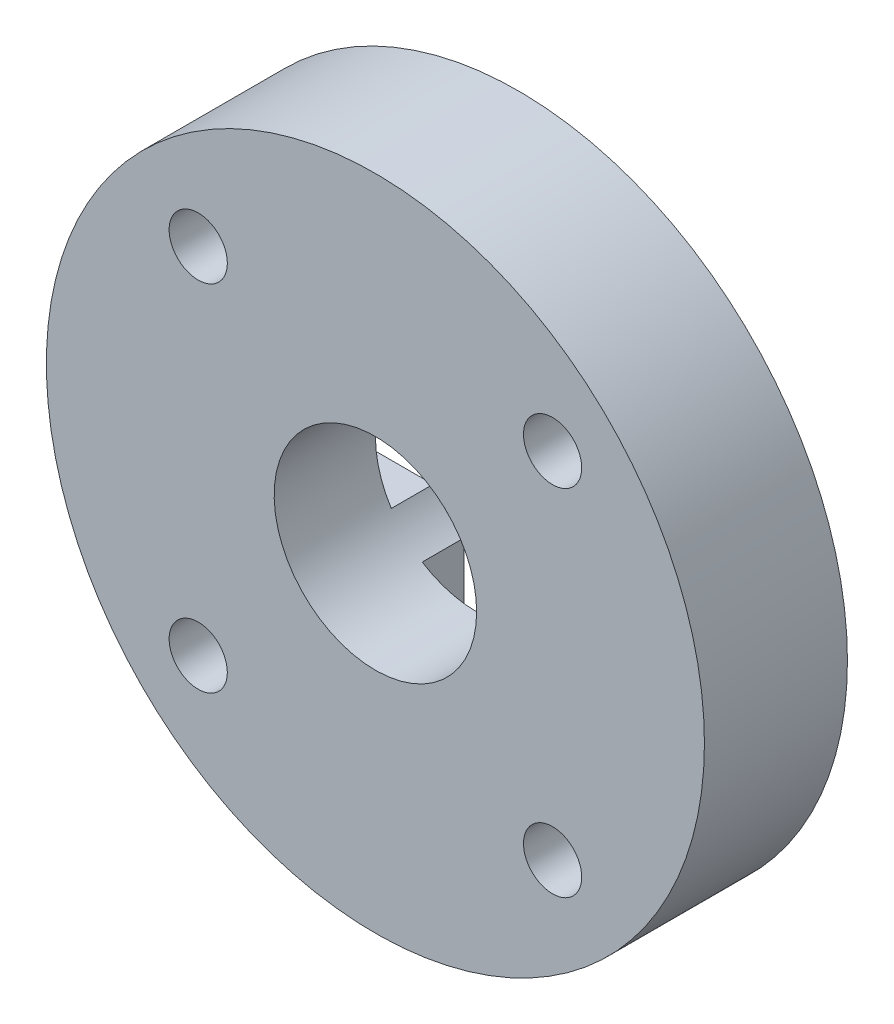
ISO-10303-21;
HEADER;
FILE_DESCRIPTION(('STEP AP214'),'2;1');
FILE_NAME('part.step','',(''),(''),'','','');
FILE_SCHEMA(('AUTOMOTIVE_DESIGN { 1 0 10303 214 1 1 1 1 }'));
ENDSEC;
DATA;
#1=APPLICATION_CONTEXT('core data for automotive mechanical design processes');
#2=APPLICATION_PROTOCOL_DEFINITION('international standard','automotive_design',2000,#1);
#3=PRODUCT_CONTEXT('',#1,'mechanical');
#4=PRODUCT('Part','Part','',(#3));
#5=PRODUCT_RELATED_PRODUCT_CATEGORY('part','',(#4));
#6=PRODUCT_DEFINITION_FORMATION('','',#4);
#7=PRODUCT_DEFINITION_CONTEXT('part definition',#1,'design');
#8=PRODUCT_DEFINITION('design','',#6,#7);
#9=PRODUCT_DEFINITION_SHAPE('','',#8);
#10=(LENGTH_UNIT() NAMED_UNIT(*) SI_UNIT(.MILLI.,.METRE.));
#11=(NAMED_UNIT(*) PLANE_ANGLE_UNIT() SI_UNIT($,.RADIAN.));
#12=(NAMED_UNIT(*) SI_UNIT($,.STERADIAN.) SOLID_ANGLE_UNIT());
#13=UNCERTAINTY_MEASURE_WITH_UNIT(LENGTH_MEASURE(1.E-05),#10,'distance_accuracy_value','');
#14=(GEOMETRIC_REPRESENTATION_CONTEXT(3) GLOBAL_UNCERTAINTY_ASSIGNED_CONTEXT((#13)) GLOBAL_UNIT_ASSIGNED_CONTEXT((#10,
#11,#12)) REPRESENTATION_CONTEXT('',''));
#15=CARTESIAN_POINT('',(0.,0.,0.));
#16=DIRECTION('',(0.,0.,1.));
#17=DIRECTION('',(1.,0.,0.));
#18=AXIS2_PLACEMENT_3D('',#15,#16,#17);
#19=CARTESIAN_POINT('',(0.,0.,-1.65));
#20=DIRECTION('',(0.,0.,1.));
#21=DIRECTION('',(1.,0.,0.));
#22=AXIS2_PLACEMENT_3D('',#19,#20,#21);
#23=PLANE('',#22);
#24=CARTESIAN_POINT('',(7.,-7.,-1.65));
#25=DIRECTION('',(0.,0.,1.));
#26=DIRECTION('',(1.,0.,0.));
#27=AXIS2_PLACEMENT_3D('',#24,#25,#26);
#28=CIRCLE('',#27,1.15);
#29=CARTESIAN_POINT('',(8.15,-7.,-1.65));
#30=VERTEX_POINT('',#29);
#31=EDGE_CURVE('E268',#30,#30,#28,.F.);
#32=ORIENTED_EDGE('',*,*,#31,.F.);
#33=EDGE_LOOP('',(#32));
#34=FACE_BOUND('',#33,.T.);
#35=CARTESIAN_POINT('',(-7.,-7.,-1.65));
#36=DIRECTION('',(0.,0.,1.));
#37=DIRECTION('',(1.,0.,0.));
#38=AXIS2_PLACEMENT_3D('',#35,#36,#37);
#39=CIRCLE('',#38,1.15);
#40=CARTESIAN_POINT('',(-5.85,-7.,-1.65));
#41=VERTEX_POINT('',#40);
#42=EDGE_CURVE('E289',#41,#41,#39,.F.);
#43=ORIENTED_EDGE('',*,*,#42,.F.);
#44=EDGE_LOOP('',(#43));
#45=FACE_BOUND('',#44,.T.);
#46=CARTESIAN_POINT('',(-7.,7.,-1.65));
#47=DIRECTION('',(0.,0.,1.));
#48=DIRECTION('',(1.,0.,0.));
#49=AXIS2_PLACEMENT_3D('',#46,#47,#48);
#50=CIRCLE('',#49,1.15);
#51=CARTESIAN_POINT('',(-5.85,7.,-1.65));
#52=VERTEX_POINT('',#51);
#53=EDGE_CURVE('E291',#52,#52,#50,.F.);
#54=ORIENTED_EDGE('',*,*,#53,.F.);
#55=EDGE_LOOP('',(#54));
#56=FACE_BOUND('',#55,.T.);
#57=CARTESIAN_POINT('',(7.,7.,-1.65));
#58=DIRECTION('',(0.,0.,1.));
#59=DIRECTION('',(1.,0.,0.));
#60=AXIS2_PLACEMENT_3D('',#57,#58,#59);
#61=CIRCLE('',#60,1.15);
#62=CARTESIAN_POINT('',(8.15,7.,-1.65));
#63=VERTEX_POINT('',#62);
#64=EDGE_CURVE('E300',#63,#63,#61,.F.);
#65=ORIENTED_EDGE('',*,*,#64,.F.);
#66=EDGE_LOOP('',(#65));
#67=FACE_BOUND('',#66,.T.);
#68=CARTESIAN_POINT('',(0.,0.,-1.65));
#69=DIRECTION('',(0.,0.,1.));
#70=DIRECTION('',(1.,0.,0.));
#71=AXIS2_PLACEMENT_3D('',#68,#69,#70);
#72=CIRCLE('',#71,13.);
#73=CARTESIAN_POINT('',(13.,0.,-1.65));
#74=VERTEX_POINT('',#73);
#75=EDGE_CURVE('E215',#74,#74,#72,.T.);
#76=ORIENTED_EDGE('',*,*,#75,.F.);
#77=EDGE_LOOP('',(#76));
#78=FACE_BOUND('',#77,.T.);
#79=DIRECTION('',(-1.,0.,0.));
#80=VECTOR('',#79,1.);
#81=CARTESIAN_POINT('',(-8.15,2.15,-1.65));
#82=LINE('',#81,#80);
#83=CARTESIAN_POINT('',(8.15,2.15,-1.65));
#84=VERTEX_POINT('',#83);
#85=CARTESIAN_POINT('',(3.37305499510459,2.15,-1.65));
#86=VERTEX_POINT('',#85);
#87=EDGE_CURVE('E172',#84,#86,#82,.T.);
#88=ORIENTED_EDGE('',*,*,#87,.T.);
#89=CARTESIAN_POINT('',(0.,0.,-1.65));
#90=DIRECTION('',(0.,0.,1.));
#91=DIRECTION('',(1.,0.,0.));
#92=AXIS2_PLACEMENT_3D('',#89,#90,#91);
#93=CIRCLE('',#92,4.);
#94=CARTESIAN_POINT('',(2.15,3.37305499510459,-1.65));
#95=VERTEX_POINT('',#94);
#96=EDGE_CURVE('E151',#86,#95,#93,.T.);
#97=ORIENTED_EDGE('',*,*,#96,.T.);
#98=DIRECTION('',(0.,1.,0.));
#99=VECTOR('',#98,1.);
#100=CARTESIAN_POINT('',(2.15,-8.15,-1.65));
#101=LINE('',#100,#99);
#102=CARTESIAN_POINT('',(2.15,8.15,-1.65));
#103=VERTEX_POINT('',#102);
#104=EDGE_CURVE('E226',#95,#103,#101,.T.);
#105=ORIENTED_EDGE('',*,*,#104,.T.);
#106=CARTESIAN_POINT('',(0.,8.15,-1.65));
#107=DIRECTION('',(0.,0.,1.));
#108=DIRECTION('',(1.,0.,0.));
#109=AXIS2_PLACEMENT_3D('',#106,#107,#108);
#110=CIRCLE('',#109,2.15);
#111=CARTESIAN_POINT('',(-2.15,8.15,-1.65));
#112=VERTEX_POINT('',#111);
#113=EDGE_CURVE('E274',#103,#112,#110,.T.);
#114=ORIENTED_EDGE('',*,*,#113,.T.);
#115=DIRECTION('',(0.,-1.,0.));
#116=VECTOR('',#115,1.);
#117=CARTESIAN_POINT('',(-2.15,-8.15,-1.65));
#118=LINE('',#117,#116);
#119=CARTESIAN_POINT('',(-2.15,3.37305499510459,-1.65));
#120=VERTEX_POINT('',#119);
#121=EDGE_CURVE('E238',#112,#120,#118,.T.);
#122=ORIENTED_EDGE('',*,*,#121,.T.);
#123=CARTESIAN_POINT('',(-3.37305499510459,2.15,-1.65));
#124=VERTEX_POINT('',#123);
#125=EDGE_CURVE('E62',#120,#124,#93,.T.);
#126=ORIENTED_EDGE('',*,*,#125,.T.);
#127=CARTESIAN_POINT('',(-8.15,2.15,-1.65));
#128=VERTEX_POINT('',#127);
#129=EDGE_CURVE('E187',#124,#128,#82,.T.);
#130=ORIENTED_EDGE('',*,*,#129,.T.);
#131=CARTESIAN_POINT('',(-8.15,0.,-1.65));
#132=DIRECTION('',(0.,0.,1.));
#133=DIRECTION('',(1.,0.,0.));
#134=AXIS2_PLACEMENT_3D('',#131,#132,#133);
#135=CIRCLE('',#134,2.15);
#136=CARTESIAN_POINT('',(-8.15,-2.15,-1.65));
#137=VERTEX_POINT('',#136);
#138=EDGE_CURVE('E278',#128,#137,#135,.T.);
#139=ORIENTED_EDGE('',*,*,#138,.T.);
#140=DIRECTION('',(1.,0.,0.));
#141=VECTOR('',#140,1.);
#142=CARTESIAN_POINT('',(-8.15,-2.15,-1.65));
#143=LINE('',#142,#141);
#144=CARTESIAN_POINT('',(-3.37305499510459,-2.15,-1.65));
#145=VERTEX_POINT('',#144);
#146=EDGE_CURVE('E194',#137,#145,#143,.T.);
#147=ORIENTED_EDGE('',*,*,#146,.T.);
#148=CARTESIAN_POINT('',(-2.15,-3.37305499510459,-1.65));
#149=VERTEX_POINT('',#148);
#150=EDGE_CURVE('E637',#145,#149,#93,.T.);
#151=ORIENTED_EDGE('',*,*,#150,.T.);
#152=CARTESIAN_POINT('',(-2.15,-8.15,-1.65));
#153=VERTEX_POINT('',#152);
#154=EDGE_CURVE('E53',#149,#153,#118,.T.);
#155=ORIENTED_EDGE('',*,*,#154,.T.);
#156=CARTESIAN_POINT('',(0.,-8.15,-1.65));
#157=DIRECTION('',(0.,0.,1.));
#158=DIRECTION('',(1.,0.,0.));
#159=AXIS2_PLACEMENT_3D('',#156,#157,#158);
#160=CIRCLE('',#159,2.15);
#161=CARTESIAN_POINT('',(2.15,-8.15,-1.65));
#162=VERTEX_POINT('',#161);
#163=EDGE_CURVE('E270',#153,#162,#160,.T.);
#164=ORIENTED_EDGE('',*,*,#163,.T.);
#165=CARTESIAN_POINT('',(2.15,-3.37305499510459,-1.65));
#166=VERTEX_POINT('',#165);
#167=EDGE_CURVE('E231',#162,#166,#101,.T.);
#168=ORIENTED_EDGE('',*,*,#167,.T.);
#169=CARTESIAN_POINT('',(3.37305499510459,-2.15,-1.65));
#170=VERTEX_POINT('',#169);
#171=EDGE_CURVE('E67',#166,#170,#93,.T.);
#172=ORIENTED_EDGE('',*,*,#171,.T.);
#173=CARTESIAN_POINT('',(8.15,-2.15,-1.65));
#174=VERTEX_POINT('',#173);
#175=EDGE_CURVE('E354',#170,#174,#143,.T.);
#176=ORIENTED_EDGE('',*,*,#175,.T.);
#177=CARTESIAN_POINT('',(8.15,0.,-1.65));
#178=DIRECTION('',(0.,0.,1.));
#179=DIRECTION('',(1.,0.,0.));
#180=AXIS2_PLACEMENT_3D('',#177,#178,#179);
#181=CIRCLE('',#180,2.15);
#182=EDGE_CURVE('E182',#174,#84,#181,.T.);
#183=ORIENTED_EDGE('',*,*,#182,.T.);
#184=EDGE_LOOP('',(#88,#97,#105,#114,#122,#126,#130,#139,#147,#151,#155,#164,#168,#172,#176,#183));
#185=FACE_BOUND('',#184,.T.);
#186=ADVANCED_FACE('F44',(#34,#45,#56,#67,#78,#185),#23,.F.);
#187=CARTESIAN_POINT('',(-8.15,-2.15,0.));
#188=DIRECTION('',(0.,1.,0.));
#189=DIRECTION('',(0.,0.,1.));
#190=AXIS2_PLACEMENT_3D('',#187,#188,#189);
#191=PLANE('',#190);
#192=ORIENTED_EDGE('',*,*,#175,.F.);
#193=DIRECTION('',(0.,0.,-1.));
#194=VECTOR('',#193,1.);
#195=CARTESIAN_POINT('',(3.37305499510459,-2.15,0.));
#196=LINE('',#195,#194);
#197=CARTESIAN_POINT('',(3.37305499510459,-2.15,0.));
#198=VERTEX_POINT('',#197);
#199=EDGE_CURVE('E178',#170,#198,#196,.F.);
#200=ORIENTED_EDGE('',*,*,#199,.T.);
#201=DIRECTION('',(1.,0.,0.));
#202=VECTOR('',#201,1.);
#203=CARTESIAN_POINT('',(-8.15,-2.15,0.));
#204=LINE('',#203,#202);
#205=CARTESIAN_POINT('',(8.15,-2.15,0.));
#206=VERTEX_POINT('',#205);
#207=EDGE_CURVE('E184',#198,#206,#204,.T.);
#208=ORIENTED_EDGE('',*,*,#207,.T.);
#209=DIRECTION('',(0.,0.,-1.));
#210=VECTOR('',#209,1.);
#211=CARTESIAN_POINT('',(8.15,-2.15,0.));
#212=LINE('',#211,#210);
#213=EDGE_CURVE('E204',#206,#174,#212,.T.);
#214=ORIENTED_EDGE('',*,*,#213,.T.);
#215=EDGE_LOOP('',(#192,#200,#208,#214));
#216=FACE_BOUND('',#215,.T.);
#217=ADVANCED_FACE('F407',(#216),#191,.T.);
#218=CARTESIAN_POINT('',(-8.15,2.15,0.));
#219=DIRECTION('',(0.,-1.,0.));
#220=DIRECTION('',(0.,0.,-1.));
#221=AXIS2_PLACEMENT_3D('',#218,#219,#220);
#222=PLANE('',#221);
#223=DIRECTION('',(-1.,0.,0.));
#224=VECTOR('',#223,1.);
#225=CARTESIAN_POINT('',(-8.15,2.15,0.));
#226=LINE('',#225,#224);
#227=CARTESIAN_POINT('',(8.15,2.15,0.));
#228=VERTEX_POINT('',#227);
#229=CARTESIAN_POINT('',(3.37305499510459,2.15,0.));
#230=VERTEX_POINT('',#229);
#231=EDGE_CURVE('E176',#228,#230,#226,.T.);
#232=ORIENTED_EDGE('',*,*,#231,.T.);
#233=DIRECTION('',(0.,0.,-1.));
#234=VECTOR('',#233,1.);
#235=CARTESIAN_POINT('',(3.37305499510459,2.15,0.));
#236=LINE('',#235,#234);
#237=EDGE_CURVE('E156',#230,#86,#236,.T.);
#238=ORIENTED_EDGE('',*,*,#237,.T.);
#239=ORIENTED_EDGE('',*,*,#87,.F.);
#240=DIRECTION('',(0.,0.,-1.));
#241=VECTOR('',#240,1.);
#242=CARTESIAN_POINT('',(8.15,2.15,0.));
#243=LINE('',#242,#241);
#244=EDGE_CURVE('E202',#228,#84,#243,.T.);
#245=ORIENTED_EDGE('',*,*,#244,.F.);
#246=EDGE_LOOP('',(#232,#238,#239,#245));
#247=FACE_BOUND('',#246,.T.);
#248=ADVANCED_FACE('F175',(#247),#222,.T.);
#249=ORIENTED_EDGE('',*,*,#129,.F.);
#250=DIRECTION('',(0.,0.,-1.));
#251=VECTOR('',#250,1.);
#252=CARTESIAN_POINT('',(-3.37305499510459,2.15,0.));
#253=LINE('',#252,#251);
#254=CARTESIAN_POINT('',(-3.37305499510459,2.15,0.));
#255=VERTEX_POINT('',#254);
#256=EDGE_CURVE('E177',#124,#255,#253,.F.);
#257=ORIENTED_EDGE('',*,*,#256,.T.);
#258=CARTESIAN_POINT('',(-8.15,2.15,0.));
#259=VERTEX_POINT('',#258);
#260=EDGE_CURVE('E359',#255,#259,#226,.T.);
#261=ORIENTED_EDGE('',*,*,#260,.T.);
#262=DIRECTION('',(0.,0.,-1.));
#263=VECTOR('',#262,1.);
#264=CARTESIAN_POINT('',(-8.15,2.15,0.));
#265=LINE('',#264,#263);
#266=EDGE_CURVE('E199',#259,#128,#265,.T.);
#267=ORIENTED_EDGE('',*,*,#266,.T.);
#268=EDGE_LOOP('',(#249,#257,#261,#267));
#269=FACE_BOUND('',#268,.T.);
#270=ADVANCED_FACE('F370',(#269),#222,.T.);
#271=CARTESIAN_POINT('',(-8.15,-2.15,0.));
#272=VERTEX_POINT('',#271);
#273=CARTESIAN_POINT('',(-3.37305499510459,-2.15,0.));
#274=VERTEX_POINT('',#273);
#275=EDGE_CURVE('E192',#272,#274,#204,.T.);
#276=ORIENTED_EDGE('',*,*,#275,.T.);
#277=DIRECTION('',(0.,0.,-1.));
#278=VECTOR('',#277,1.);
#279=CARTESIAN_POINT('',(-3.37305499510459,-2.15,0.));
#280=LINE('',#279,#278);
#281=EDGE_CURVE('E322',#274,#145,#280,.T.);
#282=ORIENTED_EDGE('',*,*,#281,.T.);
#283=ORIENTED_EDGE('',*,*,#146,.F.);
#284=DIRECTION('',(0.,0.,-1.));
#285=VECTOR('',#284,1.);
#286=CARTESIAN_POINT('',(-8.15,-2.15,0.));
#287=LINE('',#286,#285);
#288=EDGE_CURVE('E206',#272,#137,#287,.T.);
#289=ORIENTED_EDGE('',*,*,#288,.F.);
#290=EDGE_LOOP('',(#276,#282,#283,#289));
#291=FACE_BOUND('',#290,.T.);
#292=ADVANCED_FACE('F411',(#291),#191,.T.);
#293=CARTESIAN_POINT('',(2.15,-8.15,0.));
#294=DIRECTION('',(-1.,0.,0.));
#295=DIRECTION('',(0.,0.,1.));
#296=AXIS2_PLACEMENT_3D('',#293,#294,#295);
#297=PLANE('',#296);
#298=ORIENTED_EDGE('',*,*,#104,.F.);
#299=DIRECTION('',(0.,0.,-1.));
#300=VECTOR('',#299,1.);
#301=CARTESIAN_POINT('',(2.15,3.37305499510459,0.));
#302=LINE('',#301,#300);
#303=CARTESIAN_POINT('',(2.15,3.37305499510459,0.));
#304=VERTEX_POINT('',#303);
#305=EDGE_CURVE('E162',#95,#304,#302,.F.);
#306=ORIENTED_EDGE('',*,*,#305,.T.);
#307=DIRECTION('',(0.,1.,0.));
#308=VECTOR('',#307,1.);
#309=CARTESIAN_POINT('',(2.15,-8.15,0.));
#310=LINE('',#309,#308);
#311=CARTESIAN_POINT('',(2.15,8.15,0.));
#312=VERTEX_POINT('',#311);
#313=EDGE_CURVE('E258',#304,#312,#310,.T.);
#314=ORIENTED_EDGE('',*,*,#313,.T.);
#315=DIRECTION('',(0.,0.,-1.));
#316=VECTOR('',#315,1.);
#317=CARTESIAN_POINT('',(2.15,8.15,0.));
#318=LINE('',#317,#316);
#319=EDGE_CURVE('E346',#312,#103,#318,.T.);
#320=ORIENTED_EDGE('',*,*,#319,.T.);
#321=EDGE_LOOP('',(#298,#306,#314,#320));
#322=FACE_BOUND('',#321,.T.);
#323=ADVANCED_FACE('F393',(#322),#297,.T.);
#324=CARTESIAN_POINT('',(-2.15,-8.15,0.));
#325=DIRECTION('',(1.,0.,0.));
#326=DIRECTION('',(0.,0.,-1.));
#327=AXIS2_PLACEMENT_3D('',#324,#325,#326);
#328=PLANE('',#327);
#329=DIRECTION('',(0.,-1.,0.));
#330=VECTOR('',#329,1.);
#331=CARTESIAN_POINT('',(-2.15,-8.15,0.));
#332=LINE('',#331,#330);
#333=CARTESIAN_POINT('',(-2.15,8.15,0.));
#334=VERTEX_POINT('',#333);
#335=CARTESIAN_POINT('',(-2.15,3.37305499510459,0.));
#336=VERTEX_POINT('',#335);
#337=EDGE_CURVE('E247',#334,#336,#332,.T.);
#338=ORIENTED_EDGE('',*,*,#337,.T.);
#339=DIRECTION('',(0.,0.,-1.));
#340=VECTOR('',#339,1.);
#341=CARTESIAN_POINT('',(-2.15,3.37305499510459,0.));
#342=LINE('',#341,#340);
#343=EDGE_CURVE('E329',#336,#120,#342,.T.);
#344=ORIENTED_EDGE('',*,*,#343,.T.);
#345=ORIENTED_EDGE('',*,*,#121,.F.);
#346=DIRECTION('',(0.,0.,-1.));
#347=VECTOR('',#346,1.);
#348=CARTESIAN_POINT('',(-2.15,8.15,0.));
#349=LINE('',#348,#347);
#350=EDGE_CURVE('E256',#334,#112,#349,.T.);
#351=ORIENTED_EDGE('',*,*,#350,.F.);
#352=EDGE_LOOP('',(#338,#344,#345,#351));
#353=FACE_BOUND('',#352,.T.);
#354=ADVANCED_FACE('F387',(#353),#328,.T.);
#355=ORIENTED_EDGE('',*,*,#154,.F.);
#356=DIRECTION('',(0.,0.,-1.));
#357=VECTOR('',#356,1.);
#358=CARTESIAN_POINT('',(-2.15,-3.37305499510459,0.));
#359=LINE('',#358,#357);
#360=CARTESIAN_POINT('',(-2.15,-3.37305499510459,0.));
#361=VERTEX_POINT('',#360);
#362=EDGE_CURVE('E170',#149,#361,#359,.F.);
#363=ORIENTED_EDGE('',*,*,#362,.T.);
#364=CARTESIAN_POINT('',(-2.15,-8.15,0.));
#365=VERTEX_POINT('',#364);
#366=EDGE_CURVE('E245',#361,#365,#332,.T.);
#367=ORIENTED_EDGE('',*,*,#366,.T.);
#368=DIRECTION('',(0.,0.,-1.));
#369=VECTOR('',#368,1.);
#370=CARTESIAN_POINT('',(-2.15,-8.15,0.));
#371=LINE('',#370,#369);
#372=EDGE_CURVE('E350',#365,#153,#371,.T.);
#373=ORIENTED_EDGE('',*,*,#372,.T.);
#374=EDGE_LOOP('',(#355,#363,#367,#373));
#375=FACE_BOUND('',#374,.T.);
#376=ADVANCED_FACE('F334',(#375),#328,.T.);
#377=CARTESIAN_POINT('',(2.15,-8.15,0.));
#378=VERTEX_POINT('',#377);
#379=CARTESIAN_POINT('',(2.15,-3.37305499510459,0.));
#380=VERTEX_POINT('',#379);
#381=EDGE_CURVE('E257',#378,#380,#310,.T.);
#382=ORIENTED_EDGE('',*,*,#381,.T.);
#383=DIRECTION('',(0.,0.,-1.));
#384=VECTOR('',#383,1.);
#385=CARTESIAN_POINT('',(2.15,-3.37305499510459,0.));
#386=LINE('',#385,#384);
#387=EDGE_CURVE('E11',#380,#166,#386,.T.);
#388=ORIENTED_EDGE('',*,*,#387,.T.);
#389=ORIENTED_EDGE('',*,*,#167,.F.);
#390=DIRECTION('',(0.,0.,-1.));
#391=VECTOR('',#390,1.);
#392=CARTESIAN_POINT('',(2.15,-8.15,0.));
#393=LINE('',#392,#391);
#394=EDGE_CURVE('E343',#378,#162,#393,.T.);
#395=ORIENTED_EDGE('',*,*,#394,.F.);
#396=EDGE_LOOP('',(#382,#388,#389,#395));
#397=FACE_BOUND('',#396,.T.);
#398=ADVANCED_FACE('F344',(#397),#297,.T.);
#399=CARTESIAN_POINT('',(0.,0.,4.));
#400=DIRECTION('',(0.,0.,1.));
#401=DIRECTION('',(1.,0.,0.));
#402=AXIS2_PLACEMENT_3D('',#399,#400,#401);
#403=PLANE('',#402);
#404=CARTESIAN_POINT('',(7.,-7.,4.));
#405=DIRECTION('',(0.,0.,1.));
#406=DIRECTION('',(1.,0.,0.));
#407=AXIS2_PLACEMENT_3D('',#404,#405,#406);
#408=CIRCLE('',#407,1.15);
#409=CARTESIAN_POINT('',(8.15,-7.,4.));
#410=VERTEX_POINT('',#409);
#411=EDGE_CURVE('E306',#410,#410,#408,.T.);
#412=ORIENTED_EDGE('',*,*,#411,.F.);
#413=EDGE_LOOP('',(#412));
#414=FACE_BOUND('',#413,.T.);
#415=CARTESIAN_POINT('',(-7.,-7.,4.));
#416=DIRECTION('',(0.,0.,1.));
#417=DIRECTION('',(1.,0.,0.));
#418=AXIS2_PLACEMENT_3D('',#415,#416,#417);
#419=CIRCLE('',#418,1.15);
#420=CARTESIAN_POINT('',(-5.85,-7.,4.));
#421=VERTEX_POINT('',#420);
#422=EDGE_CURVE('E309',#421,#421,#419,.T.);
#423=ORIENTED_EDGE('',*,*,#422,.F.);
#424=EDGE_LOOP('',(#423));
#425=FACE_BOUND('',#424,.T.);
#426=CARTESIAN_POINT('',(-7.,7.,4.));
#427=DIRECTION('',(0.,0.,1.));
#428=DIRECTION('',(1.,0.,0.));
#429=AXIS2_PLACEMENT_3D('',#426,#427,#428);
#430=CIRCLE('',#429,1.15);
#431=CARTESIAN_POINT('',(-5.85,7.,4.));
#432=VERTEX_POINT('',#431);
#433=EDGE_CURVE('E304',#432,#432,#430,.T.);
#434=ORIENTED_EDGE('',*,*,#433,.F.);
#435=EDGE_LOOP('',(#434));
#436=FACE_BOUND('',#435,.T.);
#437=CARTESIAN_POINT('',(7.,7.,4.));
#438=DIRECTION('',(0.,0.,1.));
#439=DIRECTION('',(1.,0.,0.));
#440=AXIS2_PLACEMENT_3D('',#437,#438,#439);
#441=CIRCLE('',#440,1.15);
#442=CARTESIAN_POINT('',(8.15,7.,4.));
#443=VERTEX_POINT('',#442);
#444=EDGE_CURVE('E301',#443,#443,#441,.T.);
#445=ORIENTED_EDGE('',*,*,#444,.F.);
#446=EDGE_LOOP('',(#445));
#447=FACE_BOUND('',#446,.T.);
#448=CARTESIAN_POINT('',(0.,0.,4.));
#449=DIRECTION('',(0.,0.,1.));
#450=DIRECTION('',(1.,0.,0.));
#451=AXIS2_PLACEMENT_3D('',#448,#449,#450);
#452=CIRCLE('',#451,13.);
#453=CARTESIAN_POINT('',(13.,0.,4.));
#454=VERTEX_POINT('',#453);
#455=EDGE_CURVE('E225',#454,#454,#452,.T.);
#456=ORIENTED_EDGE('',*,*,#455,.T.);
#457=EDGE_LOOP('',(#456));
#458=FACE_BOUND('',#457,.T.);
#459=CARTESIAN_POINT('',(0.,0.,4.));
#460=DIRECTION('',(0.,0.,1.));
#461=DIRECTION('',(1.,0.,0.));
#462=AXIS2_PLACEMENT_3D('',#459,#460,#461);
#463=CIRCLE('',#462,4.);
#464=CARTESIAN_POINT('',(4.,0.,4.));
#465=VERTEX_POINT('',#464);
#466=EDGE_CURVE('E217',#465,#465,#463,.T.);
#467=ORIENTED_EDGE('',*,*,#466,.F.);
#468=EDGE_LOOP('',(#467));
#469=FACE_BOUND('',#468,.T.);
#470=ADVANCED_FACE('F421',(#414,#425,#436,#447,#458,#469),#403,.T.);
#471=CARTESIAN_POINT('',(0.,0.,4.));
#472=DIRECTION('',(0.,0.,-1.));
#473=DIRECTION('',(-1.,0.,0.));
#474=AXIS2_PLACEMENT_3D('',#471,#472,#473);
#475=CYLINDRICAL_SURFACE('',#474,13.);
#476=ORIENTED_EDGE('',*,*,#455,.F.);
#477=EDGE_LOOP('',(#476));
#478=FACE_BOUND('',#477,.T.);
#479=ORIENTED_EDGE('',*,*,#75,.T.);
#480=EDGE_LOOP('',(#479));
#481=FACE_BOUND('',#480,.T.);
#482=ADVANCED_FACE('F50',(#478,#481),#475,.T.);
#483=CARTESIAN_POINT('',(0.,0.,4.));
#484=DIRECTION('',(0.,0.,-1.));
#485=DIRECTION('',(-1.,0.,0.));
#486=AXIS2_PLACEMENT_3D('',#483,#484,#485);
#487=CYLINDRICAL_SURFACE('',#486,4.);
#488=ORIENTED_EDGE('',*,*,#466,.T.);
#489=EDGE_LOOP('',(#488));
#490=FACE_BOUND('',#489,.T.);
#491=CARTESIAN_POINT('',(0.,0.,0.));
#492=DIRECTION('',(0.,0.,1.));
#493=DIRECTION('',(1.,0.,0.));
#494=AXIS2_PLACEMENT_3D('',#491,#492,#493);
#495=CIRCLE('',#494,4.);
#496=EDGE_CURVE('E223',#304,#336,#495,.T.);
#497=ORIENTED_EDGE('',*,*,#496,.F.);
#498=ORIENTED_EDGE('',*,*,#305,.F.);
#499=ORIENTED_EDGE('',*,*,#96,.F.);
#500=ORIENTED_EDGE('',*,*,#237,.F.);
#501=EDGE_CURVE('E212',#198,#230,#495,.T.);
#502=ORIENTED_EDGE('',*,*,#501,.F.);
#503=ORIENTED_EDGE('',*,*,#199,.F.);
#504=ORIENTED_EDGE('',*,*,#171,.F.);
#505=ORIENTED_EDGE('',*,*,#387,.F.);
#506=EDGE_CURVE('E218',#361,#380,#495,.T.);
#507=ORIENTED_EDGE('',*,*,#506,.F.);
#508=ORIENTED_EDGE('',*,*,#362,.F.);
#509=ORIENTED_EDGE('',*,*,#150,.F.);
#510=ORIENTED_EDGE('',*,*,#281,.F.);
#511=EDGE_CURVE('E219',#255,#274,#495,.T.);
#512=ORIENTED_EDGE('',*,*,#511,.F.);
#513=ORIENTED_EDGE('',*,*,#256,.F.);
#514=ORIENTED_EDGE('',*,*,#125,.F.);
#515=ORIENTED_EDGE('',*,*,#343,.F.);
#516=EDGE_LOOP('',(#497,#498,#499,#500,#502,#503,#504,#505,#507,#508,#509,#510,#512,#513,#514,#515));
#517=FACE_BOUND('',#516,.T.);
#518=ADVANCED_FACE('F158',(#490,#517),#487,.F.);
#519=CARTESIAN_POINT('',(0.,0.,0.));
#520=DIRECTION('',(0.,0.,-1.));
#521=DIRECTION('',(-1.,0.,0.));
#522=AXIS2_PLACEMENT_3D('',#519,#520,#521);
#523=PLANE('',#522);
#524=ORIENTED_EDGE('',*,*,#231,.F.);
#525=CARTESIAN_POINT('',(8.15,0.,0.));
#526=DIRECTION('',(0.,0.,1.));
#527=DIRECTION('',(1.,0.,0.));
#528=AXIS2_PLACEMENT_3D('',#525,#526,#527);
#529=CIRCLE('',#528,2.15);
#530=EDGE_CURVE('E252',#206,#228,#529,.T.);
#531=ORIENTED_EDGE('',*,*,#530,.F.);
#532=ORIENTED_EDGE('',*,*,#207,.F.);
#533=ORIENTED_EDGE('',*,*,#501,.T.);
#534=EDGE_LOOP('',(#524,#531,#532,#533));
#535=FACE_BOUND('',#534,.T.);
#536=ADVANCED_FACE('F423',(#535),#523,.T.);
#537=ORIENTED_EDGE('',*,*,#275,.F.);
#538=CARTESIAN_POINT('',(-8.15,0.,0.));
#539=DIRECTION('',(0.,0.,1.));
#540=DIRECTION('',(1.,0.,0.));
#541=AXIS2_PLACEMENT_3D('',#538,#539,#540);
#542=CIRCLE('',#541,2.15);
#543=EDGE_CURVE('E280',#259,#272,#542,.T.);
#544=ORIENTED_EDGE('',*,*,#543,.F.);
#545=ORIENTED_EDGE('',*,*,#260,.F.);
#546=ORIENTED_EDGE('',*,*,#511,.T.);
#547=EDGE_LOOP('',(#537,#544,#545,#546));
#548=FACE_BOUND('',#547,.T.);
#549=ADVANCED_FACE('F373',(#548),#523,.T.);
#550=CARTESIAN_POINT('',(0.,0.,0.));
#551=DIRECTION('',(0.,0.,-1.));
#552=DIRECTION('',(-1.,0.,0.));
#553=AXIS2_PLACEMENT_3D('',#550,#551,#552);
#554=PLANE('',#553);
#555=ORIENTED_EDGE('',*,*,#337,.F.);
#556=CARTESIAN_POINT('',(0.,8.15,0.));
#557=DIRECTION('',(0.,0.,1.));
#558=DIRECTION('',(1.,0.,0.));
#559=AXIS2_PLACEMENT_3D('',#556,#557,#558);
#560=CIRCLE('',#559,2.15);
#561=EDGE_CURVE('E272',#312,#334,#560,.T.);
#562=ORIENTED_EDGE('',*,*,#561,.F.);
#563=ORIENTED_EDGE('',*,*,#313,.F.);
#564=ORIENTED_EDGE('',*,*,#496,.T.);
#565=EDGE_LOOP('',(#555,#562,#563,#564));
#566=FACE_BOUND('',#565,.T.);
#567=ADVANCED_FACE('F382',(#566),#554,.T.);
#568=ORIENTED_EDGE('',*,*,#381,.F.);
#569=CARTESIAN_POINT('',(0.,-8.15,0.));
#570=DIRECTION('',(0.,0.,1.));
#571=DIRECTION('',(1.,0.,0.));
#572=AXIS2_PLACEMENT_3D('',#569,#570,#571);
#573=CIRCLE('',#572,2.15);
#574=EDGE_CURVE('E265',#365,#378,#573,.T.);
#575=ORIENTED_EDGE('',*,*,#574,.F.);
#576=ORIENTED_EDGE('',*,*,#366,.F.);
#577=ORIENTED_EDGE('',*,*,#506,.T.);
#578=EDGE_LOOP('',(#568,#575,#576,#577));
#579=FACE_BOUND('',#578,.T.);
#580=ADVANCED_FACE('F342',(#579),#554,.T.);
#581=CARTESIAN_POINT('',(0.,-8.15,0.));
#582=DIRECTION('',(0.,0.,-1.));
#583=DIRECTION('',(-1.,0.,0.));
#584=AXIS2_PLACEMENT_3D('',#581,#582,#583);
#585=CYLINDRICAL_SURFACE('',#584,2.15);
#586=ORIENTED_EDGE('',*,*,#163,.F.);
#587=ORIENTED_EDGE('',*,*,#372,.F.);
#588=ORIENTED_EDGE('',*,*,#574,.T.);
#589=ORIENTED_EDGE('',*,*,#394,.T.);
#590=EDGE_LOOP('',(#586,#587,#588,#589));
#591=FACE_BOUND('',#590,.T.);
#592=ADVANCED_FACE('F391',(#591),#585,.F.);
#593=CARTESIAN_POINT('',(0.,8.15,0.));
#594=DIRECTION('',(0.,0.,-1.));
#595=DIRECTION('',(-1.,0.,0.));
#596=AXIS2_PLACEMENT_3D('',#593,#594,#595);
#597=CYLINDRICAL_SURFACE('',#596,2.15);
#598=ORIENTED_EDGE('',*,*,#319,.F.);
#599=ORIENTED_EDGE('',*,*,#561,.T.);
#600=ORIENTED_EDGE('',*,*,#350,.T.);
#601=ORIENTED_EDGE('',*,*,#113,.F.);
#602=EDGE_LOOP('',(#598,#599,#600,#601));
#603=FACE_BOUND('',#602,.T.);
#604=ADVANCED_FACE('F394',(#603),#597,.F.);
#605=CARTESIAN_POINT('',(-8.15,0.,0.));
#606=DIRECTION('',(0.,0.,-1.));
#607=DIRECTION('',(-1.,0.,0.));
#608=AXIS2_PLACEMENT_3D('',#605,#606,#607);
#609=CYLINDRICAL_SURFACE('',#608,2.15);
#610=ORIENTED_EDGE('',*,*,#543,.T.);
#611=ORIENTED_EDGE('',*,*,#288,.T.);
#612=ORIENTED_EDGE('',*,*,#138,.F.);
#613=ORIENTED_EDGE('',*,*,#266,.F.);
#614=EDGE_LOOP('',(#610,#611,#612,#613));
#615=FACE_BOUND('',#614,.T.);
#616=ADVANCED_FACE('F395',(#615),#609,.F.);
#617=CARTESIAN_POINT('',(8.15,0.,0.));
#618=DIRECTION('',(0.,0.,-1.));
#619=DIRECTION('',(-1.,0.,0.));
#620=AXIS2_PLACEMENT_3D('',#617,#618,#619);
#621=CYLINDRICAL_SURFACE('',#620,2.15);
#622=ORIENTED_EDGE('',*,*,#182,.F.);
#623=ORIENTED_EDGE('',*,*,#213,.F.);
#624=ORIENTED_EDGE('',*,*,#530,.T.);
#625=ORIENTED_EDGE('',*,*,#244,.T.);
#626=EDGE_LOOP('',(#622,#623,#624,#625));
#627=FACE_BOUND('',#626,.T.);
#628=ADVANCED_FACE('F402',(#627),#621,.F.);
#629=CARTESIAN_POINT('',(7.,7.,4.));
#630=DIRECTION('',(0.,0.,-1.));
#631=DIRECTION('',(-1.,0.,0.));
#632=AXIS2_PLACEMENT_3D('',#629,#630,#631);
#633=CYLINDRICAL_SURFACE('',#632,1.15);
#634=ORIENTED_EDGE('',*,*,#444,.T.);
#635=EDGE_LOOP('',(#634));
#636=FACE_BOUND('',#635,.T.);
#637=ORIENTED_EDGE('',*,*,#64,.T.);
#638=EDGE_LOOP('',(#637));
#639=FACE_BOUND('',#638,.T.);
#640=ADVANCED_FACE('F443',(#636,#639),#633,.F.);
#641=CARTESIAN_POINT('',(-7.,7.,4.));
#642=DIRECTION('',(0.,0.,-1.));
#643=DIRECTION('',(-1.,0.,0.));
#644=AXIS2_PLACEMENT_3D('',#641,#642,#643);
#645=CYLINDRICAL_SURFACE('',#644,1.15);
#646=ORIENTED_EDGE('',*,*,#433,.T.);
#647=EDGE_LOOP('',(#646));
#648=FACE_BOUND('',#647,.T.);
#649=ORIENTED_EDGE('',*,*,#53,.T.);
#650=EDGE_LOOP('',(#649));
#651=FACE_BOUND('',#650,.T.);
#652=ADVANCED_FACE('F447',(#648,#651),#645,.F.);
#653=CARTESIAN_POINT('',(-7.,-7.,4.));
#654=DIRECTION('',(0.,0.,-1.));
#655=DIRECTION('',(-1.,0.,0.));
#656=AXIS2_PLACEMENT_3D('',#653,#654,#655);
#657=CYLINDRICAL_SURFACE('',#656,1.15);
#658=ORIENTED_EDGE('',*,*,#422,.T.);
#659=EDGE_LOOP('',(#658));
#660=FACE_BOUND('',#659,.T.);
#661=ORIENTED_EDGE('',*,*,#42,.T.);
#662=EDGE_LOOP('',(#661));
#663=FACE_BOUND('',#662,.T.);
#664=ADVANCED_FACE('F458',(#660,#663),#657,.F.);
#665=CARTESIAN_POINT('',(7.,-7.,4.));
#666=DIRECTION('',(0.,0.,-1.));
#667=DIRECTION('',(-1.,0.,0.));
#668=AXIS2_PLACEMENT_3D('',#665,#666,#667);
#669=CYLINDRICAL_SURFACE('',#668,1.15);
#670=ORIENTED_EDGE('',*,*,#411,.T.);
#671=EDGE_LOOP('',(#670));
#672=FACE_BOUND('',#671,.T.);
#673=ORIENTED_EDGE('',*,*,#31,.T.);
#674=EDGE_LOOP('',(#673));
#675=FACE_BOUND('',#674,.T.);
#676=ADVANCED_FACE('F465',(#672,#675),#669,.F.);
#677=CLOSED_SHELL('',(#186,#217,#248,#270,#292,#323,#354,#376,#398,#470,#482,#518,#536,#549,
#567,#580,#592,#604,#616,#628,#640,#652,#664,#676));
#678=MANIFOLD_SOLID_BREP('B2',#677);
#679=ADVANCED_BREP_SHAPE_REPRESENTATION('',(#18,#678),#14);
#680=SHAPE_DEFINITION_REPRESENTATION(#9,#679);
ENDSEC;
END-ISO-10303-21;
